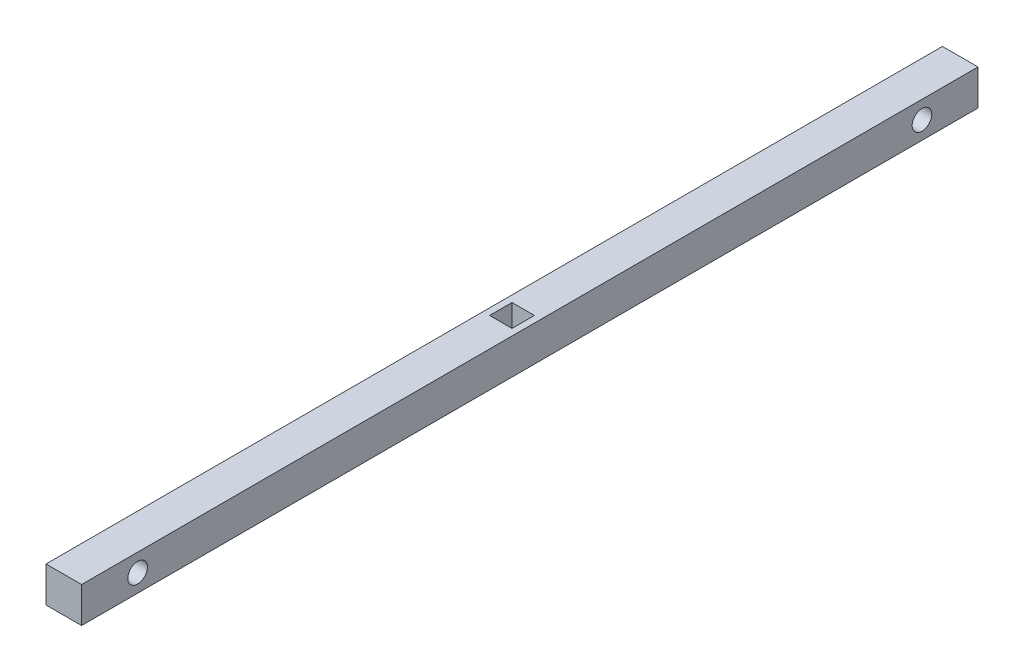
ISO-10303-21;
HEADER;
FILE_DESCRIPTION(('STEP AP214'),'2;1');
FILE_NAME('part.step','',(''),(''),'','','');
FILE_SCHEMA(('AUTOMOTIVE_DESIGN { 1 0 10303 214 1 1 1 1 }'));
ENDSEC;
DATA;
#1=APPLICATION_CONTEXT('core data for automotive mechanical design processes');
#2=APPLICATION_PROTOCOL_DEFINITION('international standard','automotive_design',2000,#1);
#3=PRODUCT_CONTEXT('',#1,'mechanical');
#4=PRODUCT('Part','Part','',(#3));
#5=PRODUCT_RELATED_PRODUCT_CATEGORY('part','',(#4));
#6=PRODUCT_DEFINITION_FORMATION('','',#4);
#7=PRODUCT_DEFINITION_CONTEXT('part definition',#1,'design');
#8=PRODUCT_DEFINITION('design','',#6,#7);
#9=PRODUCT_DEFINITION_SHAPE('','',#8);
#10=(LENGTH_UNIT() NAMED_UNIT(*) SI_UNIT(.MILLI.,.METRE.));
#11=(NAMED_UNIT(*) PLANE_ANGLE_UNIT() SI_UNIT($,.RADIAN.));
#12=(NAMED_UNIT(*) SI_UNIT($,.STERADIAN.) SOLID_ANGLE_UNIT());
#13=UNCERTAINTY_MEASURE_WITH_UNIT(LENGTH_MEASURE(1.E-05),#10,'distance_accuracy_value','');
#14=(GEOMETRIC_REPRESENTATION_CONTEXT(3) GLOBAL_UNCERTAINTY_ASSIGNED_CONTEXT((#13)) GLOBAL_UNIT_ASSIGNED_CONTEXT((#10,
#11,#12)) REPRESENTATION_CONTEXT('',''));
#15=CARTESIAN_POINT('',(0.,0.,0.));
#16=DIRECTION('',(0.,0.,1.));
#17=DIRECTION('',(1.,0.,0.));
#18=AXIS2_PLACEMENT_3D('',#15,#16,#17);
#19=CARTESIAN_POINT('',(3.175,-3.175,609.6));
#20=DIRECTION('',(-1.,0.,0.));
#21=DIRECTION('',(0.,0.,1.));
#22=AXIS2_PLACEMENT_3D('',#19,#20,#21);
#23=PLANE('',#22);
#24=CARTESIAN_POINT('',(3.175,0.,-599.6));
#25=DIRECTION('',(-1.,0.,0.));
#26=DIRECTION('',(0.,0.,1.));
#27=AXIS2_PLACEMENT_3D('',#24,#25,#26);
#28=CIRCLE('',#27,1.74999999999997);
#29=CARTESIAN_POINT('',(3.175,0.,-597.85));
#30=VERTEX_POINT('',#29);
#31=EDGE_CURVE('E157',#30,#30,#28,.T.);
#32=ORIENTED_EDGE('',*,*,#31,.T.);
#33=EDGE_LOOP('',(#32));
#34=FACE_BOUND('',#33,.T.);
#35=CARTESIAN_POINT('',(3.175,0.,-459.6));
#36=DIRECTION('',(-1.,0.,0.));
#37=DIRECTION('',(0.,0.,1.));
#38=AXIS2_PLACEMENT_3D('',#35,#36,#37);
#39=CIRCLE('',#38,1.75);
#40=CARTESIAN_POINT('',(3.175,0.,-457.85));
#41=VERTEX_POINT('',#40);
#42=EDGE_CURVE('E146',#41,#41,#39,.T.);
#43=ORIENTED_EDGE('',*,*,#42,.T.);
#44=EDGE_LOOP('',(#43));
#45=FACE_BOUND('',#44,.T.);
#46=DIRECTION('',(0.,0.,-1.));
#47=VECTOR('',#46,1.);
#48=CARTESIAN_POINT('',(3.175,3.175,609.6));
#49=LINE('',#48,#47);
#50=CARTESIAN_POINT('',(3.175,3.175,-449.6));
#51=VERTEX_POINT('',#50);
#52=CARTESIAN_POINT('',(3.175,3.175,-609.6));
#53=VERTEX_POINT('',#52);
#54=EDGE_CURVE('E46',#51,#53,#49,.T.);
#55=ORIENTED_EDGE('',*,*,#54,.F.);
#56=DIRECTION('',(0.,-1.,0.));
#57=VECTOR('',#56,1.);
#58=CARTESIAN_POINT('',(3.175,-3.175,-449.6));
#59=LINE('',#58,#57);
#60=CARTESIAN_POINT('',(3.175,-3.175,-449.6));
#61=VERTEX_POINT('',#60);
#62=EDGE_CURVE('E175',#51,#61,#59,.T.);
#63=ORIENTED_EDGE('',*,*,#62,.T.);
#64=DIRECTION('',(0.,0.,-1.));
#65=VECTOR('',#64,1.);
#66=CARTESIAN_POINT('',(3.175,-3.175,609.6));
#67=LINE('',#66,#65);
#68=CARTESIAN_POINT('',(3.175,-3.175,-609.6));
#69=VERTEX_POINT('',#68);
#70=EDGE_CURVE('E195',#61,#69,#67,.T.);
#71=ORIENTED_EDGE('',*,*,#70,.T.);
#72=DIRECTION('',(0.,1.,0.));
#73=VECTOR('',#72,1.);
#74=CARTESIAN_POINT('',(3.175,-3.175,-609.6));
#75=LINE('',#74,#73);
#76=EDGE_CURVE('E179',#69,#53,#75,.T.);
#77=ORIENTED_EDGE('',*,*,#76,.T.);
#78=EDGE_LOOP('',(#55,#63,#71,#77));
#79=FACE_BOUND('',#78,.T.);
#80=ADVANCED_FACE('F38',(#34,#45,#79),#23,.F.);
#81=CARTESIAN_POINT('',(-3.175,3.175,609.6));
#82=DIRECTION('',(0.,-1.,0.));
#83=DIRECTION('',(0.,0.,-1.));
#84=AXIS2_PLACEMENT_3D('',#81,#82,#83);
#85=PLANE('',#84);
#86=DIRECTION('',(-1.,0.,0.));
#87=VECTOR('',#86,1.);
#88=CARTESIAN_POINT('',(-2.,3.175,-531.6));
#89=LINE('',#88,#87);
#90=CARTESIAN_POINT('',(2.,3.175,-531.6));
#91=VERTEX_POINT('',#90);
#92=CARTESIAN_POINT('',(-2.,3.175,-531.6));
#93=VERTEX_POINT('',#92);
#94=EDGE_CURVE('E137',#91,#93,#89,.T.);
#95=ORIENTED_EDGE('',*,*,#94,.F.);
#96=DIRECTION('',(0.,0.,-1.));
#97=VECTOR('',#96,1.);
#98=CARTESIAN_POINT('',(2.,3.175,-531.6));
#99=LINE('',#98,#97);
#100=CARTESIAN_POINT('',(2.,3.175,-527.6));
#101=VERTEX_POINT('',#100);
#102=EDGE_CURVE('E53',#101,#91,#99,.T.);
#103=ORIENTED_EDGE('',*,*,#102,.F.);
#104=DIRECTION('',(1.,0.,0.));
#105=VECTOR('',#104,1.);
#106=CARTESIAN_POINT('',(-2.,3.175,-527.6));
#107=LINE('',#106,#105);
#108=CARTESIAN_POINT('',(-2.,3.175,-527.6));
#109=VERTEX_POINT('',#108);
#110=EDGE_CURVE('E124',#109,#101,#107,.T.);
#111=ORIENTED_EDGE('',*,*,#110,.F.);
#112=DIRECTION('',(0.,0.,1.));
#113=VECTOR('',#112,1.);
#114=CARTESIAN_POINT('',(-2.,3.175,-531.6));
#115=LINE('',#114,#113);
#116=EDGE_CURVE('E128',#93,#109,#115,.T.);
#117=ORIENTED_EDGE('',*,*,#116,.F.);
#118=EDGE_LOOP('',(#95,#103,#111,#117));
#119=FACE_BOUND('',#118,.T.);
#120=DIRECTION('',(0.,0.,-1.));
#121=VECTOR('',#120,1.);
#122=CARTESIAN_POINT('',(-3.175,3.175,609.6));
#123=LINE('',#122,#121);
#124=CARTESIAN_POINT('',(-3.175,3.175,-449.6));
#125=VERTEX_POINT('',#124);
#126=CARTESIAN_POINT('',(-3.175,3.175,-609.6));
#127=VERTEX_POINT('',#126);
#128=EDGE_CURVE('E201',#125,#127,#123,.T.);
#129=ORIENTED_EDGE('',*,*,#128,.F.);
#130=DIRECTION('',(1.,0.,0.));
#131=VECTOR('',#130,1.);
#132=CARTESIAN_POINT('',(-3.175,3.175,-449.6));
#133=LINE('',#132,#131);
#134=EDGE_CURVE('E171',#125,#51,#133,.T.);
#135=ORIENTED_EDGE('',*,*,#134,.T.);
#136=ORIENTED_EDGE('',*,*,#54,.T.);
#137=DIRECTION('',(-1.,0.,0.));
#138=VECTOR('',#137,1.);
#139=CARTESIAN_POINT('',(-3.175,3.175,-609.6));
#140=LINE('',#139,#138);
#141=EDGE_CURVE('E183',#53,#127,#140,.T.);
#142=ORIENTED_EDGE('',*,*,#141,.T.);
#143=EDGE_LOOP('',(#129,#135,#136,#142));
#144=FACE_BOUND('',#143,.T.);
#145=ADVANCED_FACE('F208',(#119,#144),#85,.F.);
#146=CARTESIAN_POINT('',(-3.175,-3.175,609.6));
#147=DIRECTION('',(1.,0.,0.));
#148=DIRECTION('',(0.,1.,0.));
#149=AXIS2_PLACEMENT_3D('',#146,#147,#148);
#150=PLANE('',#149);
#151=CARTESIAN_POINT('',(-3.175,0.,-599.6));
#152=DIRECTION('',(-1.,0.,0.));
#153=DIRECTION('',(0.,0.,1.));
#154=AXIS2_PLACEMENT_3D('',#151,#152,#153);
#155=CIRCLE('',#154,1.74999999999997);
#156=CARTESIAN_POINT('',(-3.175,0.,-597.85));
#157=VERTEX_POINT('',#156);
#158=EDGE_CURVE('E152',#157,#157,#155,.T.);
#159=ORIENTED_EDGE('',*,*,#158,.F.);
#160=EDGE_LOOP('',(#159));
#161=FACE_BOUND('',#160,.T.);
#162=CARTESIAN_POINT('',(-3.175,0.,-459.6));
#163=DIRECTION('',(-1.,0.,0.));
#164=DIRECTION('',(0.,0.,1.));
#165=AXIS2_PLACEMENT_3D('',#162,#163,#164);
#166=CIRCLE('',#165,1.75);
#167=CARTESIAN_POINT('',(-3.175,0.,-457.85));
#168=VERTEX_POINT('',#167);
#169=EDGE_CURVE('E161',#168,#168,#166,.T.);
#170=ORIENTED_EDGE('',*,*,#169,.F.);
#171=EDGE_LOOP('',(#170));
#172=FACE_BOUND('',#171,.T.);
#173=DIRECTION('',(0.,0.,-1.));
#174=VECTOR('',#173,1.);
#175=CARTESIAN_POINT('',(-3.175,-3.175,609.6));
#176=LINE('',#175,#174);
#177=CARTESIAN_POINT('',(-3.175,-3.175,-449.6));
#178=VERTEX_POINT('',#177);
#179=CARTESIAN_POINT('',(-3.175,-3.175,-609.6));
#180=VERTEX_POINT('',#179);
#181=EDGE_CURVE('E198',#178,#180,#176,.T.);
#182=ORIENTED_EDGE('',*,*,#181,.F.);
#183=DIRECTION('',(0.,1.,0.));
#184=VECTOR('',#183,1.);
#185=CARTESIAN_POINT('',(-3.175,-3.175,-449.6));
#186=LINE('',#185,#184);
#187=EDGE_CURVE('E156',#178,#125,#186,.T.);
#188=ORIENTED_EDGE('',*,*,#187,.T.);
#189=ORIENTED_EDGE('',*,*,#128,.T.);
#190=DIRECTION('',(0.,-1.,0.));
#191=VECTOR('',#190,1.);
#192=CARTESIAN_POINT('',(-3.175,-3.175,-609.6));
#193=LINE('',#192,#191);
#194=EDGE_CURVE('E187',#127,#180,#193,.T.);
#195=ORIENTED_EDGE('',*,*,#194,.T.);
#196=EDGE_LOOP('',(#182,#188,#189,#195));
#197=FACE_BOUND('',#196,.T.);
#198=ADVANCED_FACE('F218',(#161,#172,#197),#150,.F.);
#199=CARTESIAN_POINT('',(-3.175,-3.175,609.6));
#200=DIRECTION('',(0.,1.,0.));
#201=DIRECTION('',(-1.,0.,0.));
#202=AXIS2_PLACEMENT_3D('',#199,#200,#201);
#203=PLANE('',#202);
#204=DIRECTION('',(1.,0.,0.));
#205=VECTOR('',#204,1.);
#206=CARTESIAN_POINT('',(-2.,-3.175,-527.6));
#207=LINE('',#206,#205);
#208=CARTESIAN_POINT('',(-2.,-3.175,-527.6));
#209=VERTEX_POINT('',#208);
#210=CARTESIAN_POINT('',(2.,-3.175,-527.6));
#211=VERTEX_POINT('',#210);
#212=EDGE_CURVE('E112',#209,#211,#207,.T.);
#213=ORIENTED_EDGE('',*,*,#212,.T.);
#214=DIRECTION('',(0.,0.,-1.));
#215=VECTOR('',#214,1.);
#216=CARTESIAN_POINT('',(2.,-3.175,-531.6));
#217=LINE('',#216,#215);
#218=CARTESIAN_POINT('',(2.,-3.175,-531.6));
#219=VERTEX_POINT('',#218);
#220=EDGE_CURVE('E105',#211,#219,#217,.T.);
#221=ORIENTED_EDGE('',*,*,#220,.T.);
#222=DIRECTION('',(-1.,0.,0.));
#223=VECTOR('',#222,1.);
#224=CARTESIAN_POINT('',(-2.,-3.175,-531.6));
#225=LINE('',#224,#223);
#226=CARTESIAN_POINT('',(-2.,-3.175,-531.6));
#227=VERTEX_POINT('',#226);
#228=EDGE_CURVE('E115',#219,#227,#225,.T.);
#229=ORIENTED_EDGE('',*,*,#228,.T.);
#230=DIRECTION('',(0.,0.,1.));
#231=VECTOR('',#230,1.);
#232=CARTESIAN_POINT('',(-2.,-3.175,-531.6));
#233=LINE('',#232,#231);
#234=EDGE_CURVE('E61',#227,#209,#233,.T.);
#235=ORIENTED_EDGE('',*,*,#234,.T.);
#236=EDGE_LOOP('',(#213,#221,#229,#235));
#237=FACE_BOUND('',#236,.T.);
#238=ORIENTED_EDGE('',*,*,#70,.F.);
#239=DIRECTION('',(-1.,0.,0.));
#240=VECTOR('',#239,1.);
#241=CARTESIAN_POINT('',(-3.175,-3.175,-449.6));
#242=LINE('',#241,#240);
#243=EDGE_CURVE('E11',#61,#178,#242,.T.);
#244=ORIENTED_EDGE('',*,*,#243,.T.);
#245=ORIENTED_EDGE('',*,*,#181,.T.);
#246=DIRECTION('',(1.,0.,0.));
#247=VECTOR('',#246,1.);
#248=CARTESIAN_POINT('',(-3.175,-3.175,-609.6));
#249=LINE('',#248,#247);
#250=EDGE_CURVE('E191',#180,#69,#249,.T.);
#251=ORIENTED_EDGE('',*,*,#250,.T.);
#252=EDGE_LOOP('',(#238,#244,#245,#251));
#253=FACE_BOUND('',#252,.T.);
#254=ADVANCED_FACE('F120',(#237,#253),#203,.F.);
#255=CARTESIAN_POINT('',(0.,0.,-609.6));
#256=DIRECTION('',(0.,0.,-1.));
#257=DIRECTION('',(-1.,0.,0.));
#258=AXIS2_PLACEMENT_3D('',#255,#256,#257);
#259=PLANE('',#258);
#260=ORIENTED_EDGE('',*,*,#76,.F.);
#261=ORIENTED_EDGE('',*,*,#250,.F.);
#262=ORIENTED_EDGE('',*,*,#194,.F.);
#263=ORIENTED_EDGE('',*,*,#141,.F.);
#264=EDGE_LOOP('',(#260,#261,#262,#263));
#265=FACE_BOUND('',#264,.T.);
#266=ADVANCED_FACE('F213',(#265),#259,.T.);
#267=CARTESIAN_POINT('',(0.,0.,-449.6));
#268=DIRECTION('',(0.,0.,-1.));
#269=DIRECTION('',(-1.,0.,0.));
#270=AXIS2_PLACEMENT_3D('',#267,#268,#269);
#271=PLANE('',#270);
#272=ORIENTED_EDGE('',*,*,#134,.F.);
#273=ORIENTED_EDGE('',*,*,#187,.F.);
#274=ORIENTED_EDGE('',*,*,#243,.F.);
#275=ORIENTED_EDGE('',*,*,#62,.F.);
#276=EDGE_LOOP('',(#272,#273,#274,#275));
#277=FACE_BOUND('',#276,.T.);
#278=ADVANCED_FACE('F220',(#277),#271,.F.);
#279=CARTESIAN_POINT('',(-3.175,0.,-459.6));
#280=DIRECTION('',(1.,0.,0.));
#281=DIRECTION('',(0.,0.,-1.));
#282=AXIS2_PLACEMENT_3D('',#279,#280,#281);
#283=CYLINDRICAL_SURFACE('',#282,1.75);
#284=ORIENTED_EDGE('',*,*,#169,.T.);
#285=EDGE_LOOP('',(#284));
#286=FACE_BOUND('',#285,.T.);
#287=ORIENTED_EDGE('',*,*,#42,.F.);
#288=EDGE_LOOP('',(#287));
#289=FACE_BOUND('',#288,.T.);
#290=ADVANCED_FACE('F222',(#286,#289),#283,.F.);
#291=CARTESIAN_POINT('',(-3.175,0.,-599.6));
#292=DIRECTION('',(1.,0.,0.));
#293=DIRECTION('',(0.,0.,-1.));
#294=AXIS2_PLACEMENT_3D('',#291,#292,#293);
#295=CYLINDRICAL_SURFACE('',#294,1.74999999999997);
#296=ORIENTED_EDGE('',*,*,#158,.T.);
#297=EDGE_LOOP('',(#296));
#298=FACE_BOUND('',#297,.T.);
#299=ORIENTED_EDGE('',*,*,#31,.F.);
#300=EDGE_LOOP('',(#299));
#301=FACE_BOUND('',#300,.T.);
#302=ADVANCED_FACE('F228',(#298,#301),#295,.F.);
#303=CARTESIAN_POINT('',(2.,-3.175,-531.6));
#304=DIRECTION('',(1.,0.,0.));
#305=DIRECTION('',(0.,0.,-1.));
#306=AXIS2_PLACEMENT_3D('',#303,#304,#305);
#307=PLANE('',#306);
#308=ORIENTED_EDGE('',*,*,#102,.T.);
#309=DIRECTION('',(0.,1.,0.));
#310=VECTOR('',#309,1.);
#311=CARTESIAN_POINT('',(2.,-3.175,-531.6));
#312=LINE('',#311,#310);
#313=EDGE_CURVE('E101',#219,#91,#312,.T.);
#314=ORIENTED_EDGE('',*,*,#313,.F.);
#315=ORIENTED_EDGE('',*,*,#220,.F.);
#316=DIRECTION('',(0.,1.,0.));
#317=VECTOR('',#316,1.);
#318=CARTESIAN_POINT('',(2.,-3.175,-527.6));
#319=LINE('',#318,#317);
#320=EDGE_CURVE('E143',#211,#101,#319,.T.);
#321=ORIENTED_EDGE('',*,*,#320,.T.);
#322=EDGE_LOOP('',(#308,#314,#315,#321));
#323=FACE_BOUND('',#322,.T.);
#324=ADVANCED_FACE('F103',(#323),#307,.F.);
#325=CARTESIAN_POINT('',(-2.,-3.175,-527.6));
#326=DIRECTION('',(0.,0.,1.));
#327=DIRECTION('',(1.,0.,0.));
#328=AXIS2_PLACEMENT_3D('',#325,#326,#327);
#329=PLANE('',#328);
#330=ORIENTED_EDGE('',*,*,#110,.T.);
#331=ORIENTED_EDGE('',*,*,#320,.F.);
#332=ORIENTED_EDGE('',*,*,#212,.F.);
#333=DIRECTION('',(0.,1.,0.));
#334=VECTOR('',#333,1.);
#335=CARTESIAN_POINT('',(-2.,-3.175,-527.6));
#336=LINE('',#335,#334);
#337=EDGE_CURVE('E147',#209,#109,#336,.T.);
#338=ORIENTED_EDGE('',*,*,#337,.T.);
#339=EDGE_LOOP('',(#330,#331,#332,#338));
#340=FACE_BOUND('',#339,.T.);
#341=ADVANCED_FACE('F249',(#340),#329,.F.);
#342=CARTESIAN_POINT('',(-2.,-3.175,-531.6));
#343=DIRECTION('',(-1.,0.,0.));
#344=DIRECTION('',(0.,0.,1.));
#345=AXIS2_PLACEMENT_3D('',#342,#343,#344);
#346=PLANE('',#345);
#347=ORIENTED_EDGE('',*,*,#116,.T.);
#348=ORIENTED_EDGE('',*,*,#337,.F.);
#349=ORIENTED_EDGE('',*,*,#234,.F.);
#350=DIRECTION('',(0.,1.,0.));
#351=VECTOR('',#350,1.);
#352=CARTESIAN_POINT('',(-2.,-3.175,-531.6));
#353=LINE('',#352,#351);
#354=EDGE_CURVE('E111',#227,#93,#353,.T.);
#355=ORIENTED_EDGE('',*,*,#354,.T.);
#356=EDGE_LOOP('',(#347,#348,#349,#355));
#357=FACE_BOUND('',#356,.T.);
#358=ADVANCED_FACE('F254',(#357),#346,.F.);
#359=CARTESIAN_POINT('',(-2.,-3.175,-531.6));
#360=DIRECTION('',(0.,0.,-1.));
#361=DIRECTION('',(-1.,0.,0.));
#362=AXIS2_PLACEMENT_3D('',#359,#360,#361);
#363=PLANE('',#362);
#364=ORIENTED_EDGE('',*,*,#94,.T.);
#365=ORIENTED_EDGE('',*,*,#354,.F.);
#366=ORIENTED_EDGE('',*,*,#228,.F.);
#367=ORIENTED_EDGE('',*,*,#313,.T.);
#368=EDGE_LOOP('',(#364,#365,#366,#367));
#369=FACE_BOUND('',#368,.T.);
#370=ADVANCED_FACE('F116',(#369),#363,.F.);
#371=CLOSED_SHELL('',(#80,#145,#198,#254,#266,#278,#290,#302,#324,#341,#358,#370));
#372=MANIFOLD_SOLID_BREP('B2',#371);
#373=ADVANCED_BREP_SHAPE_REPRESENTATION('',(#18,#372),#14);
#374=SHAPE_DEFINITION_REPRESENTATION(#9,#373);
ENDSEC;
END-ISO-10303-21;
